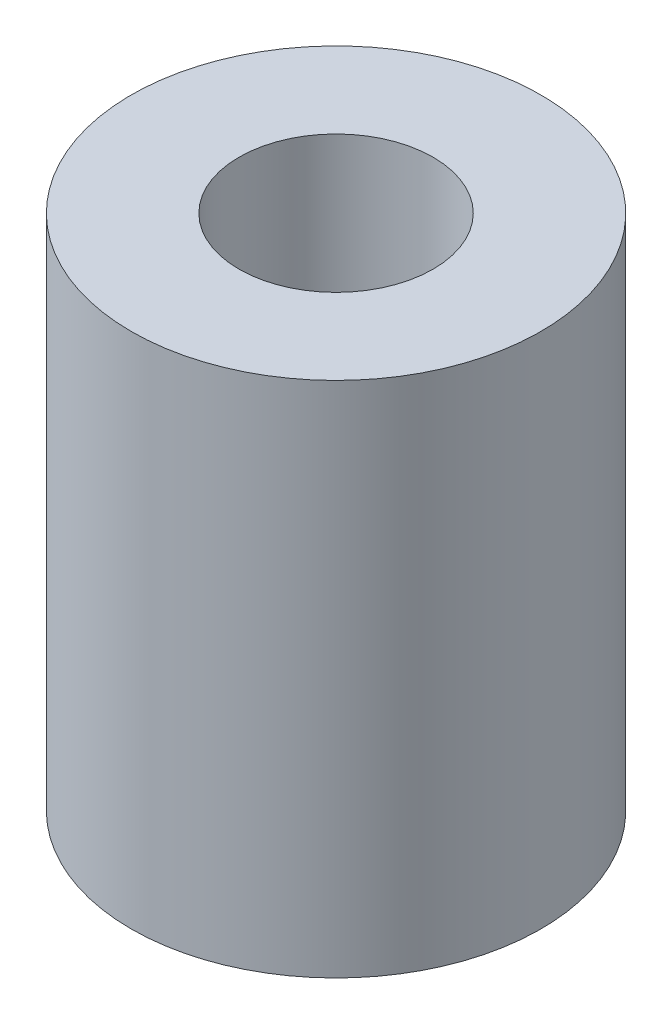
ISO-10303-21;
HEADER;
FILE_DESCRIPTION(('STEP AP214'),'2;1');
FILE_NAME('part.step','',(''),(''),'','','');
FILE_SCHEMA(('AUTOMOTIVE_DESIGN { 1 0 10303 214 1 1 1 1 }'));
ENDSEC;
DATA;
#1=APPLICATION_CONTEXT('core data for automotive mechanical design processes');
#2=APPLICATION_PROTOCOL_DEFINITION('international standard','automotive_design',2000,#1);
#3=PRODUCT_CONTEXT('',#1,'mechanical');
#4=PRODUCT('Part','Part','',(#3));
#5=PRODUCT_RELATED_PRODUCT_CATEGORY('part','',(#4));
#6=PRODUCT_DEFINITION_FORMATION('','',#4);
#7=PRODUCT_DEFINITION_CONTEXT('part definition',#1,'design');
#8=PRODUCT_DEFINITION('design','',#6,#7);
#9=PRODUCT_DEFINITION_SHAPE('','',#8);
#10=(LENGTH_UNIT() NAMED_UNIT(*) SI_UNIT(.MILLI.,.METRE.));
#11=(NAMED_UNIT(*) PLANE_ANGLE_UNIT() SI_UNIT($,.RADIAN.));
#12=(NAMED_UNIT(*) SI_UNIT($,.STERADIAN.) SOLID_ANGLE_UNIT());
#13=UNCERTAINTY_MEASURE_WITH_UNIT(LENGTH_MEASURE(1.E-05),#10,'distance_accuracy_value','');
#14=(GEOMETRIC_REPRESENTATION_CONTEXT(3) GLOBAL_UNCERTAINTY_ASSIGNED_CONTEXT((#13)) GLOBAL_UNIT_ASSIGNED_CONTEXT((#10,
#11,#12)) REPRESENTATION_CONTEXT('',''));
#15=CARTESIAN_POINT('',(0.,0.,0.));
#16=DIRECTION('',(0.,0.,1.));
#17=DIRECTION('',(1.,0.,0.));
#18=AXIS2_PLACEMENT_3D('',#15,#16,#17);
#19=CARTESIAN_POINT('',(0.,8.,0.));
#20=DIRECTION('',(0.,1.,0.));
#21=DIRECTION('',(0.,0.,1.));
#22=AXIS2_PLACEMENT_3D('',#19,#20,#21);
#23=PLANE('',#22);
#24=CARTESIAN_POINT('',(0.,8.,0.));
#25=DIRECTION('',(0.,1.,0.));
#26=DIRECTION('',(0.,0.,1.));
#27=AXIS2_PLACEMENT_3D('',#24,#25,#26);
#28=CIRCLE('',#27,3.);
#29=CARTESIAN_POINT('',(0.,8.,3.));
#30=VERTEX_POINT('',#29);
#31=EDGE_CURVE('E44',#30,#30,#28,.T.);
#32=ORIENTED_EDGE('',*,*,#31,.F.);
#33=EDGE_LOOP('',(#32));
#34=FACE_BOUND('',#33,.T.);
#35=CARTESIAN_POINT('',(0.,8.,0.));
#36=DIRECTION('',(0.,1.,0.));
#37=DIRECTION('',(0.,0.,1.));
#38=AXIS2_PLACEMENT_3D('',#35,#36,#37);
#39=CIRCLE('',#38,4.5);
#40=CARTESIAN_POINT('',(0.,8.,4.5));
#41=VERTEX_POINT('',#40);
#42=EDGE_CURVE('E58',#41,#41,#39,.T.);
#43=ORIENTED_EDGE('',*,*,#42,.T.);
#44=EDGE_LOOP('',(#43));
#45=FACE_BOUND('',#44,.T.);
#46=ADVANCED_FACE('F37',(#34,#45),#23,.T.);
#47=CARTESIAN_POINT('',(0.,0.,0.));
#48=DIRECTION('',(0.,1.,0.));
#49=DIRECTION('',(0.,0.,1.));
#50=AXIS2_PLACEMENT_3D('',#47,#48,#49);
#51=PLANE('',#50);
#52=CARTESIAN_POINT('',(0.,0.,0.));
#53=DIRECTION('',(0.,1.,0.));
#54=DIRECTION('',(0.,0.,1.));
#55=AXIS2_PLACEMENT_3D('',#52,#53,#54);
#56=CIRCLE('',#55,9.5);
#57=CARTESIAN_POINT('',(0.,0.,9.5));
#58=VERTEX_POINT('',#57);
#59=EDGE_CURVE('E10',#58,#58,#56,.T.);
#60=ORIENTED_EDGE('',*,*,#59,.F.);
#61=EDGE_LOOP('',(#60));
#62=FACE_BOUND('',#61,.T.);
#63=CARTESIAN_POINT('',(0.,0.,0.));
#64=DIRECTION('',(0.,1.,0.));
#65=DIRECTION('',(0.,0.,1.));
#66=AXIS2_PLACEMENT_3D('',#63,#64,#65);
#67=CIRCLE('',#66,3.);
#68=CARTESIAN_POINT('',(0.,0.,3.));
#69=VERTEX_POINT('',#68);
#70=EDGE_CURVE('E48',#69,#69,#67,.T.);
#71=ORIENTED_EDGE('',*,*,#70,.T.);
#72=EDGE_LOOP('',(#71));
#73=FACE_BOUND('',#72,.T.);
#74=ADVANCED_FACE('F79',(#62,#73),#51,.F.);
#75=CARTESIAN_POINT('',(0.,8.,0.));
#76=DIRECTION('',(0.,-1.,0.));
#77=DIRECTION('',(0.,0.,-1.));
#78=AXIS2_PLACEMENT_3D('',#75,#76,#77);
#79=CYLINDRICAL_SURFACE('',#78,9.5);
#80=ORIENTED_EDGE('',*,*,#59,.T.);
#81=EDGE_LOOP('',(#80));
#82=FACE_BOUND('',#81,.T.);
#83=CARTESIAN_POINT('',(0.,24.,0.));
#84=DIRECTION('',(0.,1.,0.));
#85=DIRECTION('',(0.,0.,1.));
#86=AXIS2_PLACEMENT_3D('',#83,#84,#85);
#87=CIRCLE('',#86,9.5);
#88=CARTESIAN_POINT('',(0.,24.,9.5));
#89=VERTEX_POINT('',#88);
#90=EDGE_CURVE('E53',#89,#89,#87,.T.);
#91=ORIENTED_EDGE('',*,*,#90,.F.);
#92=EDGE_LOOP('',(#91));
#93=FACE_BOUND('',#92,.T.);
#94=ADVANCED_FACE('F39',(#82,#93),#79,.T.);
#95=CARTESIAN_POINT('',(0.,8.,0.));
#96=DIRECTION('',(0.,-1.,0.));
#97=DIRECTION('',(0.,0.,-1.));
#98=AXIS2_PLACEMENT_3D('',#95,#96,#97);
#99=CYLINDRICAL_SURFACE('',#98,3.);
#100=ORIENTED_EDGE('',*,*,#31,.T.);
#101=EDGE_LOOP('',(#100));
#102=FACE_BOUND('',#101,.T.);
#103=ORIENTED_EDGE('',*,*,#70,.F.);
#104=EDGE_LOOP('',(#103));
#105=FACE_BOUND('',#104,.T.);
#106=ADVANCED_FACE('F69',(#102,#105),#99,.F.);
#107=CARTESIAN_POINT('',(0.,24.,0.));
#108=DIRECTION('',(0.,1.,0.));
#109=DIRECTION('',(0.,0.,1.));
#110=AXIS2_PLACEMENT_3D('',#107,#108,#109);
#111=PLANE('',#110);
#112=ORIENTED_EDGE('',*,*,#90,.T.);
#113=EDGE_LOOP('',(#112));
#114=FACE_BOUND('',#113,.T.);
#115=CARTESIAN_POINT('',(0.,24.,0.));
#116=DIRECTION('',(0.,1.,0.));
#117=DIRECTION('',(0.,0.,1.));
#118=AXIS2_PLACEMENT_3D('',#115,#116,#117);
#119=CIRCLE('',#118,4.5);
#120=CARTESIAN_POINT('',(0.,24.,4.5));
#121=VERTEX_POINT('',#120);
#122=EDGE_CURVE('E57',#121,#121,#119,.T.);
#123=ORIENTED_EDGE('',*,*,#122,.F.);
#124=EDGE_LOOP('',(#123));
#125=FACE_BOUND('',#124,.T.);
#126=ADVANCED_FACE('F67',(#114,#125),#111,.T.);
#127=CARTESIAN_POINT('',(0.,24.,0.));
#128=DIRECTION('',(0.,-1.,0.));
#129=DIRECTION('',(0.,0.,-1.));
#130=AXIS2_PLACEMENT_3D('',#127,#128,#129);
#131=CYLINDRICAL_SURFACE('',#130,4.5);
#132=ORIENTED_EDGE('',*,*,#122,.T.);
#133=EDGE_LOOP('',(#132));
#134=FACE_BOUND('',#133,.T.);
#135=ORIENTED_EDGE('',*,*,#42,.F.);
#136=EDGE_LOOP('',(#135));
#137=FACE_BOUND('',#136,.T.);
#138=ADVANCED_FACE('F64',(#134,#137),#131,.F.);
#139=CLOSED_SHELL('',(#46,#74,#94,#106,#126,#138));
#140=MANIFOLD_SOLID_BREP('B2',#139);
#141=ADVANCED_BREP_SHAPE_REPRESENTATION('',(#18,#140),#14);
#142=SHAPE_DEFINITION_REPRESENTATION(#9,#141);
ENDSEC;
END-ISO-10303-21;
